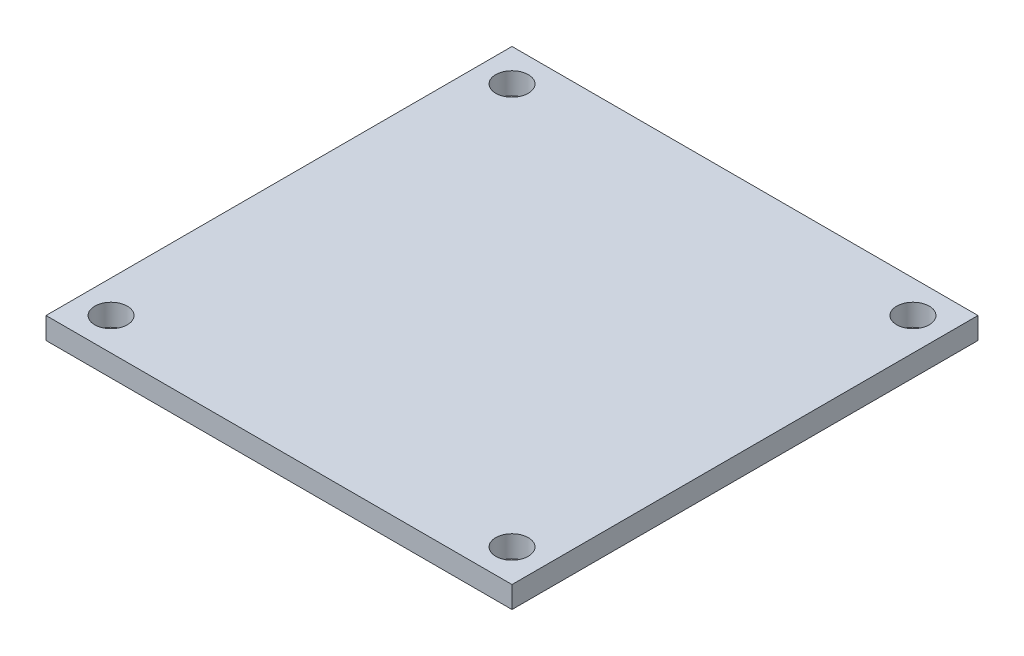
ISO-10303-21;
HEADER;
FILE_DESCRIPTION(('STEP AP214'),'2;1');
FILE_NAME('part.step','',(''),(''),'','','');
FILE_SCHEMA(('AUTOMOTIVE_DESIGN { 1 0 10303 214 1 1 1 1 }'));
ENDSEC;
DATA;
#1=APPLICATION_CONTEXT('core data for automotive mechanical design processes');
#2=APPLICATION_PROTOCOL_DEFINITION('international standard','automotive_design',2000,#1);
#3=PRODUCT_CONTEXT('',#1,'mechanical');
#4=PRODUCT('Part','Part','',(#3));
#5=PRODUCT_RELATED_PRODUCT_CATEGORY('part','',(#4));
#6=PRODUCT_DEFINITION_FORMATION('','',#4);
#7=PRODUCT_DEFINITION_CONTEXT('part definition',#1,'design');
#8=PRODUCT_DEFINITION('design','',#6,#7);
#9=PRODUCT_DEFINITION_SHAPE('','',#8);
#10=(LENGTH_UNIT() NAMED_UNIT(*) SI_UNIT(.MILLI.,.METRE.));
#11=(NAMED_UNIT(*) PLANE_ANGLE_UNIT() SI_UNIT($,.RADIAN.));
#12=(NAMED_UNIT(*) SI_UNIT($,.STERADIAN.) SOLID_ANGLE_UNIT());
#13=UNCERTAINTY_MEASURE_WITH_UNIT(LENGTH_MEASURE(1.E-05),#10,'distance_accuracy_value','');
#14=(GEOMETRIC_REPRESENTATION_CONTEXT(3) GLOBAL_UNCERTAINTY_ASSIGNED_CONTEXT((#13)) GLOBAL_UNIT_ASSIGNED_CONTEXT((#10,
#11,#12)) REPRESENTATION_CONTEXT('',''));
#15=CARTESIAN_POINT('',(0.,0.,0.));
#16=DIRECTION('',(0.,0.,1.));
#17=DIRECTION('',(1.,0.,0.));
#18=AXIS2_PLACEMENT_3D('',#15,#16,#17);
#19=CARTESIAN_POINT('',(0.,2.,0.));
#20=DIRECTION('',(0.,1.,0.));
#21=DIRECTION('',(0.,0.,1.));
#22=AXIS2_PLACEMENT_3D('',#19,#20,#21);
#23=PLANE('',#22);
#24=CARTESIAN_POINT('',(18.5,2.,-18.5));
#25=DIRECTION('',(0.,1.,0.));
#26=DIRECTION('',(0.,0.,1.));
#27=AXIS2_PLACEMENT_3D('',#24,#25,#26);
#28=CIRCLE('',#27,1.5);
#29=CARTESIAN_POINT('',(18.5,2.,-17.));
#30=VERTEX_POINT('',#29);
#31=EDGE_CURVE('E142',#30,#30,#28,.T.);
#32=ORIENTED_EDGE('',*,*,#31,.F.);
#33=EDGE_LOOP('',(#32));
#34=FACE_BOUND('',#33,.T.);
#35=CARTESIAN_POINT('',(-18.5,2.,-18.5));
#36=DIRECTION('',(0.,1.,0.));
#37=DIRECTION('',(0.,0.,1.));
#38=AXIS2_PLACEMENT_3D('',#35,#36,#37);
#39=CIRCLE('',#38,1.5);
#40=CARTESIAN_POINT('',(-18.5,2.,-17.));
#41=VERTEX_POINT('',#40);
#42=EDGE_CURVE('E112',#41,#41,#39,.T.);
#43=ORIENTED_EDGE('',*,*,#42,.F.);
#44=EDGE_LOOP('',(#43));
#45=FACE_BOUND('',#44,.T.);
#46=DIRECTION('',(0.,0.,-1.));
#47=VECTOR('',#46,1.);
#48=CARTESIAN_POINT('',(21.5,2.,-21.5));
#49=LINE('',#48,#47);
#50=CARTESIAN_POINT('',(21.5,2.,21.5));
#51=VERTEX_POINT('',#50);
#52=CARTESIAN_POINT('',(21.5,2.,-21.5));
#53=VERTEX_POINT('',#52);
#54=EDGE_CURVE('E92',#51,#53,#49,.T.);
#55=ORIENTED_EDGE('',*,*,#54,.T.);
#56=DIRECTION('',(-1.,0.,0.));
#57=VECTOR('',#56,1.);
#58=CARTESIAN_POINT('',(-21.5,2.,-21.5));
#59=LINE('',#58,#57);
#60=CARTESIAN_POINT('',(-21.5,2.,-21.5));
#61=VERTEX_POINT('',#60);
#62=EDGE_CURVE('E87',#53,#61,#59,.T.);
#63=ORIENTED_EDGE('',*,*,#62,.T.);
#64=DIRECTION('',(0.,0.,1.));
#65=VECTOR('',#64,1.);
#66=CARTESIAN_POINT('',(-21.5,2.,-21.5));
#67=LINE('',#66,#65);
#68=CARTESIAN_POINT('',(-21.5,2.,21.5));
#69=VERTEX_POINT('',#68);
#70=EDGE_CURVE('E90',#61,#69,#67,.T.);
#71=ORIENTED_EDGE('',*,*,#70,.T.);
#72=DIRECTION('',(1.,0.,0.));
#73=VECTOR('',#72,1.);
#74=CARTESIAN_POINT('',(-21.5,2.,21.5));
#75=LINE('',#74,#73);
#76=EDGE_CURVE('E57',#69,#51,#75,.T.);
#77=ORIENTED_EDGE('',*,*,#76,.T.);
#78=EDGE_LOOP('',(#55,#63,#71,#77));
#79=FACE_BOUND('',#78,.T.);
#80=CARTESIAN_POINT('',(-18.5,2.,18.5));
#81=DIRECTION('',(0.,1.,0.));
#82=DIRECTION('',(0.,0.,1.));
#83=AXIS2_PLACEMENT_3D('',#80,#81,#82);
#84=CIRCLE('',#83,1.5);
#85=CARTESIAN_POINT('',(-18.5,2.,20.));
#86=VERTEX_POINT('',#85);
#87=EDGE_CURVE('E134',#86,#86,#84,.T.);
#88=ORIENTED_EDGE('',*,*,#87,.F.);
#89=EDGE_LOOP('',(#88));
#90=FACE_BOUND('',#89,.T.);
#91=CARTESIAN_POINT('',(18.5,2.,18.5));
#92=DIRECTION('',(0.,1.,0.));
#93=DIRECTION('',(0.,0.,1.));
#94=AXIS2_PLACEMENT_3D('',#91,#92,#93);
#95=CIRCLE('',#94,1.5);
#96=CARTESIAN_POINT('',(18.5,2.,20.));
#97=VERTEX_POINT('',#96);
#98=EDGE_CURVE('E150',#97,#97,#95,.T.);
#99=ORIENTED_EDGE('',*,*,#98,.F.);
#100=EDGE_LOOP('',(#99));
#101=FACE_BOUND('',#100,.T.);
#102=ADVANCED_FACE('F39',(#34,#45,#79,#90,#101),#23,.T.);
#103=CARTESIAN_POINT('',(0.,0.,0.));
#104=DIRECTION('',(0.,1.,0.));
#105=DIRECTION('',(0.,0.,1.));
#106=AXIS2_PLACEMENT_3D('',#103,#104,#105);
#107=PLANE('',#106);
#108=DIRECTION('',(0.,0.,-1.));
#109=VECTOR('',#108,1.);
#110=CARTESIAN_POINT('',(21.5,0.,-21.5));
#111=LINE('',#110,#109);
#112=CARTESIAN_POINT('',(21.5,0.,21.5));
#113=VERTEX_POINT('',#112);
#114=CARTESIAN_POINT('',(21.5,0.,-21.5));
#115=VERTEX_POINT('',#114);
#116=EDGE_CURVE('E108',#113,#115,#111,.T.);
#117=ORIENTED_EDGE('',*,*,#116,.F.);
#118=DIRECTION('',(1.,0.,0.));
#119=VECTOR('',#118,1.);
#120=CARTESIAN_POINT('',(-21.5,0.,21.5));
#121=LINE('',#120,#119);
#122=CARTESIAN_POINT('',(-21.5,0.,21.5));
#123=VERTEX_POINT('',#122);
#124=EDGE_CURVE('E80',#123,#113,#121,.T.);
#125=ORIENTED_EDGE('',*,*,#124,.F.);
#126=DIRECTION('',(0.,0.,1.));
#127=VECTOR('',#126,1.);
#128=CARTESIAN_POINT('',(-21.5,0.,-21.5));
#129=LINE('',#128,#127);
#130=CARTESIAN_POINT('',(-21.5,0.,-21.5));
#131=VERTEX_POINT('',#130);
#132=EDGE_CURVE('E74',#131,#123,#129,.T.);
#133=ORIENTED_EDGE('',*,*,#132,.F.);
#134=DIRECTION('',(-1.,0.,0.));
#135=VECTOR('',#134,1.);
#136=CARTESIAN_POINT('',(-21.5,0.,-21.5));
#137=LINE('',#136,#135);
#138=EDGE_CURVE('E97',#115,#131,#137,.T.);
#139=ORIENTED_EDGE('',*,*,#138,.F.);
#140=EDGE_LOOP('',(#117,#125,#133,#139));
#141=FACE_BOUND('',#140,.T.);
#142=CARTESIAN_POINT('',(-18.5,0.,-18.5));
#143=DIRECTION('',(0.,1.,0.));
#144=DIRECTION('',(0.,0.,1.));
#145=AXIS2_PLACEMENT_3D('',#142,#143,#144);
#146=CIRCLE('',#145,1.5);
#147=CARTESIAN_POINT('',(-18.5,0.,-17.));
#148=VERTEX_POINT('',#147);
#149=EDGE_CURVE('E130',#148,#148,#146,.T.);
#150=ORIENTED_EDGE('',*,*,#149,.T.);
#151=EDGE_LOOP('',(#150));
#152=FACE_BOUND('',#151,.T.);
#153=CARTESIAN_POINT('',(-18.5,0.,18.5));
#154=DIRECTION('',(0.,1.,0.));
#155=DIRECTION('',(0.,0.,1.));
#156=AXIS2_PLACEMENT_3D('',#153,#154,#155);
#157=CIRCLE('',#156,1.5);
#158=CARTESIAN_POINT('',(-18.5,0.,20.));
#159=VERTEX_POINT('',#158);
#160=EDGE_CURVE('E138',#159,#159,#157,.T.);
#161=ORIENTED_EDGE('',*,*,#160,.T.);
#162=EDGE_LOOP('',(#161));
#163=FACE_BOUND('',#162,.T.);
#164=CARTESIAN_POINT('',(18.5,0.,-18.5));
#165=DIRECTION('',(0.,1.,0.));
#166=DIRECTION('',(0.,0.,1.));
#167=AXIS2_PLACEMENT_3D('',#164,#165,#166);
#168=CIRCLE('',#167,1.5);
#169=CARTESIAN_POINT('',(18.5,0.,-17.));
#170=VERTEX_POINT('',#169);
#171=EDGE_CURVE('E146',#170,#170,#168,.T.);
#172=ORIENTED_EDGE('',*,*,#171,.T.);
#173=EDGE_LOOP('',(#172));
#174=FACE_BOUND('',#173,.T.);
#175=CARTESIAN_POINT('',(18.5,0.,18.5));
#176=DIRECTION('',(0.,1.,0.));
#177=DIRECTION('',(0.,0.,1.));
#178=AXIS2_PLACEMENT_3D('',#175,#176,#177);
#179=CIRCLE('',#178,1.5);
#180=CARTESIAN_POINT('',(18.5,0.,20.));
#181=VERTEX_POINT('',#180);
#182=EDGE_CURVE('E154',#181,#181,#179,.T.);
#183=ORIENTED_EDGE('',*,*,#182,.T.);
#184=EDGE_LOOP('',(#183));
#185=FACE_BOUND('',#184,.T.);
#186=ADVANCED_FACE('F125',(#141,#152,#163,#174,#185),#107,.F.);
#187=CARTESIAN_POINT('',(21.5,2.,-21.5));
#188=DIRECTION('',(-1.,0.,0.));
#189=DIRECTION('',(0.,0.,1.));
#190=AXIS2_PLACEMENT_3D('',#187,#188,#189);
#191=PLANE('',#190);
#192=ORIENTED_EDGE('',*,*,#116,.T.);
#193=DIRECTION('',(0.,-1.,0.));
#194=VECTOR('',#193,1.);
#195=CARTESIAN_POINT('',(21.5,2.,-21.5));
#196=LINE('',#195,#194);
#197=EDGE_CURVE('E11',#53,#115,#196,.T.);
#198=ORIENTED_EDGE('',*,*,#197,.F.);
#199=ORIENTED_EDGE('',*,*,#54,.F.);
#200=DIRECTION('',(0.,-1.,0.));
#201=VECTOR('',#200,1.);
#202=CARTESIAN_POINT('',(21.5,2.,21.5));
#203=LINE('',#202,#201);
#204=EDGE_CURVE('E104',#51,#113,#203,.T.);
#205=ORIENTED_EDGE('',*,*,#204,.T.);
#206=EDGE_LOOP('',(#192,#198,#199,#205));
#207=FACE_BOUND('',#206,.T.);
#208=ADVANCED_FACE('F41',(#207),#191,.F.);
#209=CARTESIAN_POINT('',(-21.5,2.,-21.5));
#210=DIRECTION('',(0.,0.,1.));
#211=DIRECTION('',(1.,0.,0.));
#212=AXIS2_PLACEMENT_3D('',#209,#210,#211);
#213=PLANE('',#212);
#214=ORIENTED_EDGE('',*,*,#138,.T.);
#215=DIRECTION('',(0.,-1.,0.));
#216=VECTOR('',#215,1.);
#217=CARTESIAN_POINT('',(-21.5,2.,-21.5));
#218=LINE('',#217,#216);
#219=EDGE_CURVE('E49',#61,#131,#218,.T.);
#220=ORIENTED_EDGE('',*,*,#219,.F.);
#221=ORIENTED_EDGE('',*,*,#62,.F.);
#222=ORIENTED_EDGE('',*,*,#197,.T.);
#223=EDGE_LOOP('',(#214,#220,#221,#222));
#224=FACE_BOUND('',#223,.T.);
#225=ADVANCED_FACE('F96',(#224),#213,.F.);
#226=CARTESIAN_POINT('',(-21.5,2.,-21.5));
#227=DIRECTION('',(1.,0.,0.));
#228=DIRECTION('',(0.,0.,-1.));
#229=AXIS2_PLACEMENT_3D('',#226,#227,#228);
#230=PLANE('',#229);
#231=ORIENTED_EDGE('',*,*,#132,.T.);
#232=DIRECTION('',(0.,-1.,0.));
#233=VECTOR('',#232,1.);
#234=CARTESIAN_POINT('',(-21.5,2.,21.5));
#235=LINE('',#234,#233);
#236=EDGE_CURVE('E99',#69,#123,#235,.T.);
#237=ORIENTED_EDGE('',*,*,#236,.F.);
#238=ORIENTED_EDGE('',*,*,#70,.F.);
#239=ORIENTED_EDGE('',*,*,#219,.T.);
#240=EDGE_LOOP('',(#231,#237,#238,#239));
#241=FACE_BOUND('',#240,.T.);
#242=ADVANCED_FACE('F100',(#241),#230,.F.);
#243=CARTESIAN_POINT('',(-21.5,2.,21.5));
#244=DIRECTION('',(0.,0.,-1.));
#245=DIRECTION('',(-1.,0.,0.));
#246=AXIS2_PLACEMENT_3D('',#243,#244,#245);
#247=PLANE('',#246);
#248=ORIENTED_EDGE('',*,*,#124,.T.);
#249=ORIENTED_EDGE('',*,*,#204,.F.);
#250=ORIENTED_EDGE('',*,*,#76,.F.);
#251=ORIENTED_EDGE('',*,*,#236,.T.);
#252=EDGE_LOOP('',(#248,#249,#250,#251));
#253=FACE_BOUND('',#252,.T.);
#254=ADVANCED_FACE('F122',(#253),#247,.F.);
#255=CARTESIAN_POINT('',(-18.5,2.,-18.5));
#256=DIRECTION('',(0.,-1.,0.));
#257=DIRECTION('',(0.,0.,-1.));
#258=AXIS2_PLACEMENT_3D('',#255,#256,#257);
#259=CYLINDRICAL_SURFACE('',#258,1.5);
#260=ORIENTED_EDGE('',*,*,#42,.T.);
#261=EDGE_LOOP('',(#260));
#262=FACE_BOUND('',#261,.T.);
#263=ORIENTED_EDGE('',*,*,#149,.F.);
#264=EDGE_LOOP('',(#263));
#265=FACE_BOUND('',#264,.T.);
#266=ADVANCED_FACE('F175',(#262,#265),#259,.F.);
#267=CARTESIAN_POINT('',(-18.5,2.,18.5));
#268=DIRECTION('',(0.,-1.,0.));
#269=DIRECTION('',(0.,0.,-1.));
#270=AXIS2_PLACEMENT_3D('',#267,#268,#269);
#271=CYLINDRICAL_SURFACE('',#270,1.5);
#272=ORIENTED_EDGE('',*,*,#87,.T.);
#273=EDGE_LOOP('',(#272));
#274=FACE_BOUND('',#273,.T.);
#275=ORIENTED_EDGE('',*,*,#160,.F.);
#276=EDGE_LOOP('',(#275));
#277=FACE_BOUND('',#276,.T.);
#278=ADVANCED_FACE('F221',(#274,#277),#271,.F.);
#279=CARTESIAN_POINT('',(18.5,2.,-18.5));
#280=DIRECTION('',(0.,-1.,0.));
#281=DIRECTION('',(0.,0.,-1.));
#282=AXIS2_PLACEMENT_3D('',#279,#280,#281);
#283=CYLINDRICAL_SURFACE('',#282,1.5);
#284=ORIENTED_EDGE('',*,*,#31,.T.);
#285=EDGE_LOOP('',(#284));
#286=FACE_BOUND('',#285,.T.);
#287=ORIENTED_EDGE('',*,*,#171,.F.);
#288=EDGE_LOOP('',(#287));
#289=FACE_BOUND('',#288,.T.);
#290=ADVANCED_FACE('F229',(#286,#289),#283,.F.);
#291=CARTESIAN_POINT('',(18.5,2.,18.5));
#292=DIRECTION('',(0.,-1.,0.));
#293=DIRECTION('',(0.,0.,-1.));
#294=AXIS2_PLACEMENT_3D('',#291,#292,#293);
#295=CYLINDRICAL_SURFACE('',#294,1.5);
#296=ORIENTED_EDGE('',*,*,#98,.T.);
#297=EDGE_LOOP('',(#296));
#298=FACE_BOUND('',#297,.T.);
#299=ORIENTED_EDGE('',*,*,#182,.F.);
#300=EDGE_LOOP('',(#299));
#301=FACE_BOUND('',#300,.T.);
#302=ADVANCED_FACE('F162',(#298,#301),#295,.F.);
#303=CLOSED_SHELL('',(#102,#186,#208,#225,#242,#254,#266,#278,#290,#302));
#304=MANIFOLD_SOLID_BREP('B2',#303);
#305=ADVANCED_BREP_SHAPE_REPRESENTATION('',(#18,#304),#14);
#306=SHAPE_DEFINITION_REPRESENTATION(#9,#305);
ENDSEC;
END-ISO-10303-21;
